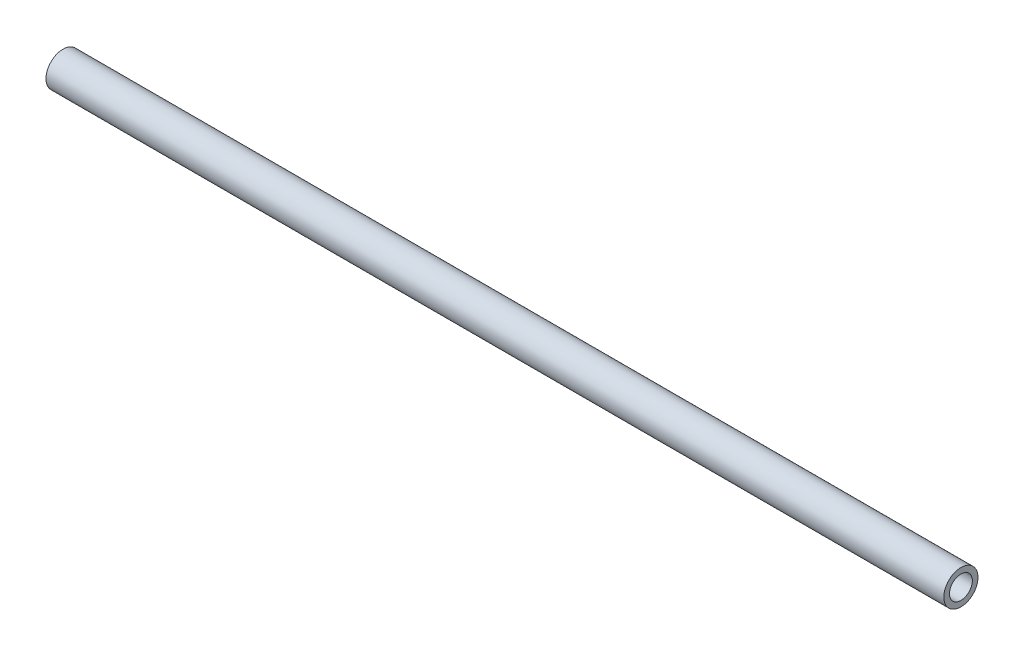
ISO-10303-21;
HEADER;
FILE_DESCRIPTION(('STEP AP214'),'2;1');
FILE_NAME('part.step','',(''),(''),'','','');
FILE_SCHEMA(('AUTOMOTIVE_DESIGN { 1 0 10303 214 1 1 1 1 }'));
ENDSEC;
DATA;
#1=APPLICATION_CONTEXT('core data for automotive mechanical design processes');
#2=APPLICATION_PROTOCOL_DEFINITION('international standard','automotive_design',2000,#1);
#3=PRODUCT_CONTEXT('',#1,'mechanical');
#4=PRODUCT('Part','Part','',(#3));
#5=PRODUCT_RELATED_PRODUCT_CATEGORY('part','',(#4));
#6=PRODUCT_DEFINITION_FORMATION('','',#4);
#7=PRODUCT_DEFINITION_CONTEXT('part definition',#1,'design');
#8=PRODUCT_DEFINITION('design','',#6,#7);
#9=PRODUCT_DEFINITION_SHAPE('','',#8);
#10=(LENGTH_UNIT() NAMED_UNIT(*) SI_UNIT(.MILLI.,.METRE.));
#11=(NAMED_UNIT(*) PLANE_ANGLE_UNIT() SI_UNIT($,.RADIAN.));
#12=(NAMED_UNIT(*) SI_UNIT($,.STERADIAN.) SOLID_ANGLE_UNIT());
#13=UNCERTAINTY_MEASURE_WITH_UNIT(LENGTH_MEASURE(1.E-05),#10,'distance_accuracy_value','');
#14=(GEOMETRIC_REPRESENTATION_CONTEXT(3) GLOBAL_UNCERTAINTY_ASSIGNED_CONTEXT((#13)) GLOBAL_UNIT_ASSIGNED_CONTEXT((#10,
#11,#12)) REPRESENTATION_CONTEXT('',''));
#15=CARTESIAN_POINT('',(0.,0.,0.));
#16=DIRECTION('',(0.,0.,1.));
#17=DIRECTION('',(1.,0.,0.));
#18=AXIS2_PLACEMENT_3D('',#15,#16,#17);
#19=CARTESIAN_POINT('',(39.37,0.,0.));
#20=DIRECTION('',(1.,0.,0.));
#21=DIRECTION('',(0.,0.,-1.));
#22=AXIS2_PLACEMENT_3D('',#19,#20,#21);
#23=PLANE('',#22);
#24=CARTESIAN_POINT('',(39.37,0.,0.));
#25=DIRECTION('',(1.,0.,0.));
#26=DIRECTION('',(0.,0.,-1.));
#27=AXIS2_PLACEMENT_3D('',#24,#25,#26);
#28=CIRCLE('',#27,1.4986);
#29=CARTESIAN_POINT('',(39.37,0.,-1.4986));
#30=VERTEX_POINT('',#29);
#31=EDGE_CURVE('E10',#30,#30,#28,.T.);
#32=ORIENTED_EDGE('',*,*,#31,.T.);
#33=EDGE_LOOP('',(#32));
#34=FACE_BOUND('',#33,.T.);
#35=CARTESIAN_POINT('',(39.37,0.,0.));
#36=DIRECTION('',(1.,0.,0.));
#37=DIRECTION('',(0.,0.,-1.));
#38=AXIS2_PLACEMENT_3D('',#35,#36,#37);
#39=CIRCLE('',#38,1.0033);
#40=CARTESIAN_POINT('',(39.37,0.,-1.0033));
#41=VERTEX_POINT('',#40);
#42=EDGE_CURVE('E55',#41,#41,#39,.T.);
#43=ORIENTED_EDGE('',*,*,#42,.F.);
#44=EDGE_LOOP('',(#43));
#45=FACE_BOUND('',#44,.T.);
#46=ADVANCED_FACE('F40',(#34,#45),#23,.T.);
#47=CARTESIAN_POINT('',(-39.37,0.,0.));
#48=DIRECTION('',(1.,0.,0.));
#49=DIRECTION('',(0.,0.,-1.));
#50=AXIS2_PLACEMENT_3D('',#47,#48,#49);
#51=PLANE('',#50);
#52=CARTESIAN_POINT('',(-39.37,0.,0.));
#53=DIRECTION('',(1.,0.,0.));
#54=DIRECTION('',(0.,0.,-1.));
#55=AXIS2_PLACEMENT_3D('',#52,#53,#54);
#56=CIRCLE('',#55,1.4986);
#57=CARTESIAN_POINT('',(-39.37,0.,-1.4986));
#58=VERTEX_POINT('',#57);
#59=EDGE_CURVE('E44',#58,#58,#56,.T.);
#60=ORIENTED_EDGE('',*,*,#59,.F.);
#61=EDGE_LOOP('',(#60));
#62=FACE_BOUND('',#61,.T.);
#63=CARTESIAN_POINT('',(-39.37,0.,0.));
#64=DIRECTION('',(1.,0.,0.));
#65=DIRECTION('',(0.,0.,-1.));
#66=AXIS2_PLACEMENT_3D('',#63,#64,#65);
#67=CIRCLE('',#66,1.0033);
#68=CARTESIAN_POINT('',(-39.37,0.,-1.0033));
#69=VERTEX_POINT('',#68);
#70=EDGE_CURVE('E57',#69,#69,#67,.T.);
#71=ORIENTED_EDGE('',*,*,#70,.T.);
#72=EDGE_LOOP('',(#71));
#73=FACE_BOUND('',#72,.T.);
#74=ADVANCED_FACE('F69',(#62,#73),#51,.F.);
#75=CARTESIAN_POINT('',(39.37,0.,0.));
#76=DIRECTION('',(-1.,0.,0.));
#77=DIRECTION('',(0.,0.,1.));
#78=AXIS2_PLACEMENT_3D('',#75,#76,#77);
#79=CYLINDRICAL_SURFACE('',#78,1.4986);
#80=ORIENTED_EDGE('',*,*,#31,.F.);
#81=EDGE_LOOP('',(#80));
#82=FACE_BOUND('',#81,.T.);
#83=ORIENTED_EDGE('',*,*,#59,.T.);
#84=EDGE_LOOP('',(#83));
#85=FACE_BOUND('',#84,.T.);
#86=ADVANCED_FACE('F42',(#82,#85),#79,.T.);
#87=CARTESIAN_POINT('',(39.37,0.,0.));
#88=DIRECTION('',(-1.,0.,0.));
#89=DIRECTION('',(0.,0.,1.));
#90=AXIS2_PLACEMENT_3D('',#87,#88,#89);
#91=CYLINDRICAL_SURFACE('',#90,1.0033);
#92=ORIENTED_EDGE('',*,*,#42,.T.);
#93=EDGE_LOOP('',(#92));
#94=FACE_BOUND('',#93,.T.);
#95=ORIENTED_EDGE('',*,*,#70,.F.);
#96=EDGE_LOOP('',(#95));
#97=FACE_BOUND('',#96,.T.);
#98=ADVANCED_FACE('F65',(#94,#97),#91,.F.);
#99=CLOSED_SHELL('',(#46,#74,#86,#98));
#100=MANIFOLD_SOLID_BREP('B2',#99);
#101=ADVANCED_BREP_SHAPE_REPRESENTATION('',(#18,#100),#14);
#102=SHAPE_DEFINITION_REPRESENTATION(#9,#101);
ENDSEC;
END-ISO-10303-21;
